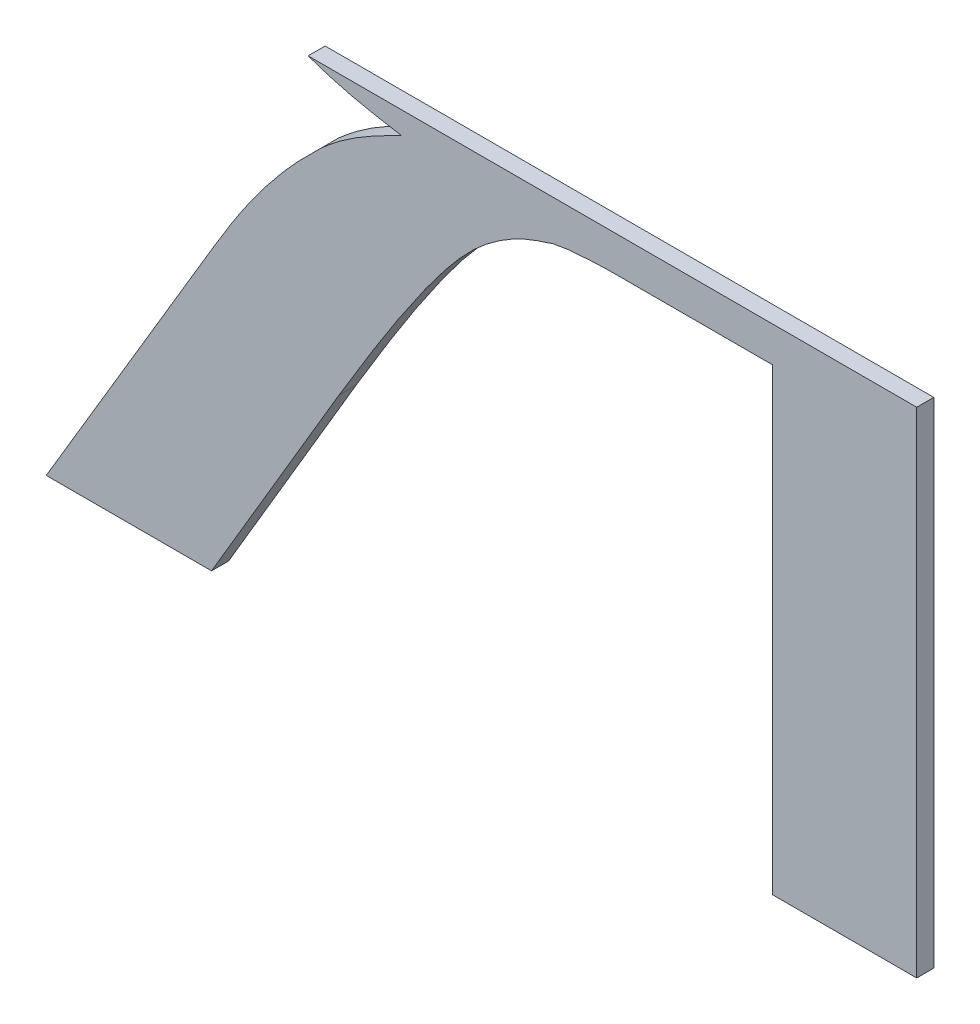
ISO-10303-21;
HEADER;
FILE_DESCRIPTION(('STEP AP214'),'2;1');
FILE_NAME('part.step','',(''),(''),'','','');
FILE_SCHEMA(('AUTOMOTIVE_DESIGN { 1 0 10303 214 1 1 1 1 }'));
ENDSEC;
DATA;
#1=APPLICATION_CONTEXT('core data for automotive mechanical design processes');
#2=APPLICATION_PROTOCOL_DEFINITION('international standard','automotive_design',2000,#1);
#3=PRODUCT_CONTEXT('',#1,'mechanical');
#4=PRODUCT('Part','Part','',(#3));
#5=PRODUCT_RELATED_PRODUCT_CATEGORY('part','',(#4));
#6=PRODUCT_DEFINITION_FORMATION('','',#4);
#7=PRODUCT_DEFINITION_CONTEXT('part definition',#1,'design');
#8=PRODUCT_DEFINITION('design','',#6,#7);
#9=PRODUCT_DEFINITION_SHAPE('','',#8);
#10=(LENGTH_UNIT() NAMED_UNIT(*) SI_UNIT(.MILLI.,.METRE.));
#11=(NAMED_UNIT(*) PLANE_ANGLE_UNIT() SI_UNIT($,.RADIAN.));
#12=(NAMED_UNIT(*) SI_UNIT($,.STERADIAN.) SOLID_ANGLE_UNIT());
#13=UNCERTAINTY_MEASURE_WITH_UNIT(LENGTH_MEASURE(1.E-05),#10,'distance_accuracy_value','');
#14=(GEOMETRIC_REPRESENTATION_CONTEXT(3) GLOBAL_UNCERTAINTY_ASSIGNED_CONTEXT((#13)) GLOBAL_UNIT_ASSIGNED_CONTEXT((#10,
#11,#12)) REPRESENTATION_CONTEXT('',''));
#15=CARTESIAN_POINT('',(0.,0.,0.));
#16=DIRECTION('',(0.,0.,1.));
#17=DIRECTION('',(1.,0.,0.));
#18=AXIS2_PLACEMENT_3D('',#15,#16,#17);
#19=CARTESIAN_POINT('',(7.30769230769232,-15.,0.5));
#20=DIRECTION('',(0.,1.,0.));
#21=DIRECTION('',(0.,0.,1.));
#22=AXIS2_PLACEMENT_3D('',#19,#20,#21);
#23=PLANE('',#22);
#24=DIRECTION('',(1.,0.,0.));
#25=VECTOR('',#24,1.);
#26=CARTESIAN_POINT('',(7.30769230769232,-15.,0.));
#27=LINE('',#26,#25);
#28=CARTESIAN_POINT('',(7.30769230769232,-15.,0.));
#29=VERTEX_POINT('',#28);
#30=CARTESIAN_POINT('',(11.5384615384616,-15.,0.));
#31=VERTEX_POINT('',#30);
#32=EDGE_CURVE('E132',#29,#31,#27,.T.);
#33=ORIENTED_EDGE('',*,*,#32,.T.);
#34=DIRECTION('',(0.,0.,-1.));
#35=VECTOR('',#34,1.);
#36=CARTESIAN_POINT('',(11.5384615384616,-15.,0.5));
#37=LINE('',#36,#35);
#38=CARTESIAN_POINT('',(11.5384615384616,-15.,0.5));
#39=VERTEX_POINT('',#38);
#40=EDGE_CURVE('E48',#39,#31,#37,.T.);
#41=ORIENTED_EDGE('',*,*,#40,.F.);
#42=DIRECTION('',(1.,0.,0.));
#43=VECTOR('',#42,1.);
#44=CARTESIAN_POINT('',(7.30769230769232,-15.,0.5));
#45=LINE('',#44,#43);
#46=CARTESIAN_POINT('',(7.30769230769232,-15.,0.5));
#47=VERTEX_POINT('',#46);
#48=EDGE_CURVE('E200',#47,#39,#45,.T.);
#49=ORIENTED_EDGE('',*,*,#48,.F.);
#50=DIRECTION('',(0.,0.,-1.));
#51=VECTOR('',#50,1.);
#52=CARTESIAN_POINT('',(7.30769230769232,-15.,0.5));
#53=LINE('',#52,#51);
#54=EDGE_CURVE('E195',#47,#29,#53,.T.);
#55=ORIENTED_EDGE('',*,*,#54,.T.);
#56=EDGE_LOOP('',(#33,#41,#49,#55));
#57=FACE_BOUND('',#56,.T.);
#58=ADVANCED_FACE('F39',(#57),#23,.F.);
#59=CARTESIAN_POINT('',(7.30769230769232,-1.53846153846154,0.5));
#60=DIRECTION('',(1.,0.,0.));
#61=DIRECTION('',(0.,0.,-1.));
#62=AXIS2_PLACEMENT_3D('',#59,#60,#61);
#63=PLANE('',#62);
#64=DIRECTION('',(0.,-1.,0.));
#65=VECTOR('',#64,1.);
#66=CARTESIAN_POINT('',(7.30769230769232,-1.53846153846154,0.));
#67=LINE('',#66,#65);
#68=CARTESIAN_POINT('',(7.30769230769232,-1.53846153846154,0.));
#69=VERTEX_POINT('',#68);
#70=EDGE_CURVE('E197',#69,#29,#67,.T.);
#71=ORIENTED_EDGE('',*,*,#70,.T.);
#72=ORIENTED_EDGE('',*,*,#54,.F.);
#73=DIRECTION('',(0.,-1.,0.));
#74=VECTOR('',#73,1.);
#75=CARTESIAN_POINT('',(7.30769230769232,-1.53846153846154,0.5));
#76=LINE('',#75,#74);
#77=CARTESIAN_POINT('',(7.30769230769232,-1.53846153846154,0.5));
#78=VERTEX_POINT('',#77);
#79=EDGE_CURVE('E193',#78,#47,#76,.T.);
#80=ORIENTED_EDGE('',*,*,#79,.F.);
#81=DIRECTION('',(0.,0.,-1.));
#82=VECTOR('',#81,1.);
#83=CARTESIAN_POINT('',(7.30769230769232,-1.53846153846154,0.5));
#84=LINE('',#83,#82);
#85=EDGE_CURVE('E188',#78,#69,#84,.T.);
#86=ORIENTED_EDGE('',*,*,#85,.T.);
#87=EDGE_LOOP('',(#71,#72,#80,#86));
#88=FACE_BOUND('',#87,.T.);
#89=ADVANCED_FACE('F330',(#88),#63,.F.);
#90=CARTESIAN_POINT('',(2.97475961538463,-1.53846153846154,0.5));
#91=DIRECTION('',(0.,1.,0.));
#92=DIRECTION('',(0.,0.,1.));
#93=AXIS2_PLACEMENT_3D('',#90,#91,#92);
#94=PLANE('',#93);
#95=DIRECTION('',(1.,0.,0.));
#96=VECTOR('',#95,1.);
#97=CARTESIAN_POINT('',(2.97475961538463,-1.53846153846154,0.));
#98=LINE('',#97,#96);
#99=CARTESIAN_POINT('',(2.97475961538463,-1.53846153846154,0.));
#100=VERTEX_POINT('',#99);
#101=EDGE_CURVE('E196',#100,#69,#98,.T.);
#102=ORIENTED_EDGE('',*,*,#101,.T.);
#103=ORIENTED_EDGE('',*,*,#85,.F.);
#104=DIRECTION('',(1.,0.,0.));
#105=VECTOR('',#104,1.);
#106=CARTESIAN_POINT('',(2.97475961538463,-1.53846153846154,0.5));
#107=LINE('',#106,#105);
#108=CARTESIAN_POINT('',(2.97475961538463,-1.53846153846154,0.5));
#109=VERTEX_POINT('',#108);
#110=EDGE_CURVE('E343',#109,#78,#107,.T.);
#111=ORIENTED_EDGE('',*,*,#110,.F.);
#112=DIRECTION('',(0.,0.,-1.));
#113=VECTOR('',#112,1.);
#114=CARTESIAN_POINT('',(2.97475961538463,-1.53846153846154,0.5));
#115=LINE('',#114,#113);
#116=EDGE_CURVE('E186',#109,#100,#115,.T.);
#117=ORIENTED_EDGE('',*,*,#116,.T.);
#118=EDGE_LOOP('',(#102,#103,#111,#117));
#119=FACE_BOUND('',#118,.T.);
#120=ADVANCED_FACE('F335',(#119),#94,.F.);
#121=CARTESIAN_POINT('',(0.889423076923093,-1.67668269230769,0.5));
#122=CARTESIAN_POINT('',(1.01136443734908,-1.65469252071142,0.5));
#123=CARTESIAN_POINT('',(1.28976021879317,-1.60448829972972,0.5));
#124=CARTESIAN_POINT('',(1.76247556098656,-1.57169984296478,0.5));
#125=CARTESIAN_POINT('',(2.33522819156776,-1.53689928277355,0.5));
#126=CARTESIAN_POINT('',(2.75031178366907,-1.5379132543762,0.5));
#127=CARTESIAN_POINT('',(2.97475961538463,-1.53846153846154,0.5));
#128=B_SPLINE_CURVE_WITH_KNOTS('',3,(#121,#122,#123,#124,#125,#126,#127),.UNSPECIFIED.,.F.,.F.,
(4,1,1,1,4),(0.,0.17749465708185,0.405225623101375,0.678388108334857,1.),.UNSPECIFIED.);
#129=DIRECTION('',(0.,0.,-1.));
#130=VECTOR('',#129,1.);
#131=SURFACE_OF_LINEAR_EXTRUSION('',#128,#130);
#132=CARTESIAN_POINT('',(0.889423076923093,-1.67668269230769,0.));
#133=CARTESIAN_POINT('',(1.01136443734908,-1.65469252071142,0.));
#134=CARTESIAN_POINT('',(1.28976021879317,-1.60448829972972,0.));
#135=CARTESIAN_POINT('',(1.76247556098656,-1.57169984296478,0.));
#136=CARTESIAN_POINT('',(2.33522819156776,-1.53689928277355,0.));
#137=CARTESIAN_POINT('',(2.75031178366907,-1.5379132543762,0.));
#138=CARTESIAN_POINT('',(2.97475961538463,-1.53846153846154,0.));
#139=B_SPLINE_CURVE_WITH_KNOTS('',3,(#132,#133,#134,#135,#136,#137,#138),.UNSPECIFIED.,.F.,.F.,
(4,1,1,1,4),(0.,0.17749465708185,0.405225623101375,0.678388108334857,1.),.UNSPECIFIED.);
#140=CARTESIAN_POINT('',(0.889423076923093,-1.67668269230769,0.));
#141=VERTEX_POINT('',#140);
#142=EDGE_CURVE('E202',#141,#100,#139,.T.);
#143=ORIENTED_EDGE('',*,*,#142,.T.);
#144=ORIENTED_EDGE('',*,*,#116,.F.);
#145=CARTESIAN_POINT('',(0.889423076923093,-1.67668269230769,0.5));
#146=VERTEX_POINT('',#145);
#147=EDGE_CURVE('E261',#146,#109,#128,.T.);
#148=ORIENTED_EDGE('',*,*,#147,.F.);
#149=DIRECTION('',(0.,0.,-1.));
#150=VECTOR('',#149,1.);
#151=CARTESIAN_POINT('',(0.889423076923093,-1.67668269230769,0.5));
#152=LINE('',#151,#150);
#153=EDGE_CURVE('E183',#146,#141,#152,.T.);
#154=ORIENTED_EDGE('',*,*,#153,.T.);
#155=EDGE_LOOP('',(#143,#144,#148,#154));
#156=FACE_BOUND('',#155,.T.);
#157=ADVANCED_FACE('F280',(#156),#131,.F.);
#158=CARTESIAN_POINT('',(-5.40865384615383,-8.66586538461539,0.5));
#159=CARTESIAN_POINT('',(-5.27425483341309,-8.44362465807356,0.5));
#160=CARTESIAN_POINT('',(-5.0138116148445,-8.01295862164048,0.5));
#161=CARTESIAN_POINT('',(-4.63761071618698,-7.38399160756765,0.5));
#162=CARTESIAN_POINT('',(-4.26875810381978,-6.80492725566571,0.5));
#163=CARTESIAN_POINT('',(-3.92665361497196,-6.25921559162821,0.5));
#164=CARTESIAN_POINT('',(-3.59741407623815,-5.75676374158386,0.5));
#165=CARTESIAN_POINT('',(-3.28422071212509,-5.29582628569616,0.5));
#166=CARTESIAN_POINT('',(-2.99569274309002,-4.87035632670218,0.5));
#167=CARTESIAN_POINT('',(-2.63831355130447,-4.37499857015927,0.5));
#168=CARTESIAN_POINT('',(-2.22238352886459,-3.82688061585735,0.5));
#169=CARTESIAN_POINT('',(-1.73702173067931,-3.26242262664401,0.5));
#170=CARTESIAN_POINT('',(-1.27481339435602,-2.81238779082192,0.5));
#171=CARTESIAN_POINT('',(-0.705595298101057,-2.37108076220757,0.5));
#172=CARTESIAN_POINT('',(-0.000532570007576415,-1.95831221626847,0.5));
#173=CARTESIAN_POINT('',(0.598784058068045,-1.76865640898321,0.5));
#174=CARTESIAN_POINT('',(0.889423076923093,-1.67668269230769,0.5));
#175=B_SPLINE_CURVE_WITH_KNOTS('',3,(#158,#159,#160,#161,#162,#163,#164,#165,#166,#167,#168,
#169,#170,#171,#172,#173,#174),.UNSPECIFIED.,.F.,.F.,(4,1,1,1,1,1,1,1,1,1,1,1,1,1,4),(0.,
0.0807814705861227,0.15654122579559,0.227934986843486,0.294310317304601,0.356867863554811,
0.414758559259275,0.467641396834016,0.516748421530013,0.604729741894054,0.68157065293939,
0.748109541621983,0.804941099535281,0.905406049500003,1.),.UNSPECIFIED.);
#176=DIRECTION('',(0.,0.,-1.));
#177=VECTOR('',#176,1.);
#178=SURFACE_OF_LINEAR_EXTRUSION('',#175,#177);
#179=CARTESIAN_POINT('',(-5.40865384615383,-8.66586538461539,0.));
#180=CARTESIAN_POINT('',(-5.27425483341309,-8.44362465807356,0.));
#181=CARTESIAN_POINT('',(-5.0138116148445,-8.01295862164048,0.));
#182=CARTESIAN_POINT('',(-4.63761071618698,-7.38399160756765,0.));
#183=CARTESIAN_POINT('',(-4.26875810381978,-6.80492725566571,0.));
#184=CARTESIAN_POINT('',(-3.92665361497196,-6.25921559162821,0.));
#185=CARTESIAN_POINT('',(-3.59741407623815,-5.75676374158386,0.));
#186=CARTESIAN_POINT('',(-3.28422071212509,-5.29582628569616,0.));
#187=CARTESIAN_POINT('',(-2.99569274309002,-4.87035632670218,0.));
#188=CARTESIAN_POINT('',(-2.63831355130447,-4.37499857015927,0.));
#189=CARTESIAN_POINT('',(-2.22238352886459,-3.82688061585735,0.));
#190=CARTESIAN_POINT('',(-1.73702173067931,-3.26242262664401,0.));
#191=CARTESIAN_POINT('',(-1.27481339435602,-2.81238779082192,0.));
#192=CARTESIAN_POINT('',(-0.705595298101057,-2.37108076220757,0.));
#193=CARTESIAN_POINT('',(-0.000532570007576415,-1.95831221626847,0.));
#194=CARTESIAN_POINT('',(0.598784058068045,-1.76865640898321,0.));
#195=CARTESIAN_POINT('',(0.889423076923093,-1.67668269230769,0.));
#196=B_SPLINE_CURVE_WITH_KNOTS('',3,(#179,#180,#181,#182,#183,#184,#185,#186,#187,#188,#189,
#190,#191,#192,#193,#194,#195),.UNSPECIFIED.,.F.,.F.,(4,1,1,1,1,1,1,1,1,1,1,1,1,1,4),(0.,
0.0807814705861227,0.15654122579559,0.227934986843486,0.294310317304601,0.356867863554811,
0.414758559259275,0.467641396834016,0.516748421530013,0.604729741894054,0.68157065293939,
0.748109541621983,0.804941099535281,0.905406049500003,1.),.UNSPECIFIED.);
#197=CARTESIAN_POINT('',(-5.40865384615383,-8.66586538461539,0.));
#198=VERTEX_POINT('',#197);
#199=EDGE_CURVE('E203',#198,#141,#196,.T.);
#200=ORIENTED_EDGE('',*,*,#199,.T.);
#201=ORIENTED_EDGE('',*,*,#153,.F.);
#202=CARTESIAN_POINT('',(-5.40865384615383,-8.66586538461539,0.5));
#203=VERTEX_POINT('',#202);
#204=EDGE_CURVE('E251',#203,#146,#175,.T.);
#205=ORIENTED_EDGE('',*,*,#204,.F.);
#206=DIRECTION('',(0.,0.,-1.));
#207=VECTOR('',#206,1.);
#208=CARTESIAN_POINT('',(-5.40865384615383,-8.66586538461539,0.5));
#209=LINE('',#208,#207);
#210=EDGE_CURVE('E179',#203,#198,#209,.T.);
#211=ORIENTED_EDGE('',*,*,#210,.T.);
#212=EDGE_LOOP('',(#200,#201,#205,#211));
#213=FACE_BOUND('',#212,.T.);
#214=ADVANCED_FACE('F275',(#213),#178,.F.);
#215=CARTESIAN_POINT('',(-9.1466346153846,-15.,0.5));
#216=DIRECTION('',(-0.861219188778507,0.508233714819954,0.));
#217=DIRECTION('',(-0.508233714819954,-0.861219188778507,0.));
#218=AXIS2_PLACEMENT_3D('',#215,#216,#217);
#219=PLANE('',#218);
#220=DIRECTION('',(0.508233714819954,0.861219188778507,0.));
#221=VECTOR('',#220,1.);
#222=CARTESIAN_POINT('',(-9.1466346153846,-15.,0.));
#223=LINE('',#222,#221);
#224=CARTESIAN_POINT('',(-9.1466346153846,-15.,0.));
#225=VERTEX_POINT('',#224);
#226=EDGE_CURVE('E212',#225,#198,#223,.T.);
#227=ORIENTED_EDGE('',*,*,#226,.T.);
#228=ORIENTED_EDGE('',*,*,#210,.F.);
#229=DIRECTION('',(0.508233714819954,0.861219188778507,0.));
#230=VECTOR('',#229,1.);
#231=CARTESIAN_POINT('',(-9.1466346153846,-15.,0.5));
#232=LINE('',#231,#230);
#233=CARTESIAN_POINT('',(-9.1466346153846,-15.,0.5));
#234=VERTEX_POINT('',#233);
#235=EDGE_CURVE('E252',#234,#203,#232,.T.);
#236=ORIENTED_EDGE('',*,*,#235,.F.);
#237=DIRECTION('',(0.,0.,-1.));
#238=VECTOR('',#237,1.);
#239=CARTESIAN_POINT('',(-9.1466346153846,-15.,0.5));
#240=LINE('',#239,#238);
#241=EDGE_CURVE('E180',#234,#225,#240,.T.);
#242=ORIENTED_EDGE('',*,*,#241,.T.);
#243=EDGE_LOOP('',(#227,#228,#236,#242));
#244=FACE_BOUND('',#243,.T.);
#245=ADVANCED_FACE('F276',(#244),#219,.F.);
#246=CARTESIAN_POINT('',(-13.9963942307692,-15.,0.5));
#247=DIRECTION('',(0.,1.,0.));
#248=DIRECTION('',(0.,0.,1.));
#249=AXIS2_PLACEMENT_3D('',#246,#247,#248);
#250=PLANE('',#249);
#251=DIRECTION('',(1.,0.,0.));
#252=VECTOR('',#251,1.);
#253=CARTESIAN_POINT('',(-13.9963942307692,-15.,0.));
#254=LINE('',#253,#252);
#255=CARTESIAN_POINT('',(-13.9963942307692,-15.,0.));
#256=VERTEX_POINT('',#255);
#257=EDGE_CURVE('E220',#256,#225,#254,.T.);
#258=ORIENTED_EDGE('',*,*,#257,.T.);
#259=ORIENTED_EDGE('',*,*,#241,.F.);
#260=DIRECTION('',(1.,0.,0.));
#261=VECTOR('',#260,1.);
#262=CARTESIAN_POINT('',(-13.9963942307692,-15.,0.5));
#263=LINE('',#262,#261);
#264=CARTESIAN_POINT('',(-13.9963942307692,-15.,0.5));
#265=VERTEX_POINT('',#264);
#266=EDGE_CURVE('E246',#265,#234,#263,.T.);
#267=ORIENTED_EDGE('',*,*,#266,.F.);
#268=DIRECTION('',(0.,0.,-1.));
#269=VECTOR('',#268,1.);
#270=CARTESIAN_POINT('',(-13.9963942307692,-15.,0.5));
#271=LINE('',#270,#269);
#272=EDGE_CURVE('E174',#265,#256,#271,.T.);
#273=ORIENTED_EDGE('',*,*,#272,.T.);
#274=EDGE_LOOP('',(#258,#259,#267,#273));
#275=FACE_BOUND('',#274,.T.);
#276=ADVANCED_FACE('F247',(#275),#250,.F.);
#277=CARTESIAN_POINT('',(-9.07451923076921,-6.71875,0.5));
#278=DIRECTION('',(0.859632156750452,-0.510913451653571,0.));
#279=DIRECTION('',(0.510913451653571,0.859632156750452,0.));
#280=AXIS2_PLACEMENT_3D('',#277,#278,#279);
#281=PLANE('',#280);
#282=DIRECTION('',(-0.510913451653571,-0.859632156750452,0.));
#283=VECTOR('',#282,1.);
#284=CARTESIAN_POINT('',(-9.07451923076921,-6.71875,0.));
#285=LINE('',#284,#283);
#286=CARTESIAN_POINT('',(-9.07451923076921,-6.71875,0.));
#287=VERTEX_POINT('',#286);
#288=EDGE_CURVE('E219',#287,#256,#285,.T.);
#289=ORIENTED_EDGE('',*,*,#288,.T.);
#290=ORIENTED_EDGE('',*,*,#272,.F.);
#291=DIRECTION('',(-0.510913451653571,-0.859632156750452,0.));
#292=VECTOR('',#291,1.);
#293=CARTESIAN_POINT('',(-9.07451923076921,-6.71875,0.5));
#294=LINE('',#293,#292);
#295=CARTESIAN_POINT('',(-9.07451923076921,-6.71875,0.5));
#296=VERTEX_POINT('',#295);
#297=EDGE_CURVE('E254',#296,#265,#294,.T.);
#298=ORIENTED_EDGE('',*,*,#297,.F.);
#299=DIRECTION('',(0.,0.,-1.));
#300=VECTOR('',#299,1.);
#301=CARTESIAN_POINT('',(-9.07451923076921,-6.71875,0.5));
#302=LINE('',#301,#300);
#303=EDGE_CURVE('E173',#296,#287,#302,.T.);
#304=ORIENTED_EDGE('',*,*,#303,.T.);
#305=EDGE_LOOP('',(#289,#290,#298,#304));
#306=FACE_BOUND('',#305,.T.);
#307=ADVANCED_FACE('F244',(#306),#281,.F.);
#308=CARTESIAN_POINT('',(-5.91346153846152,-2.63221153846154,0.5));
#309=CARTESIAN_POINT('',(-6.19686401280369,-2.91002878312352,0.5));
#310=CARTESIAN_POINT('',(-6.77899282863054,-3.4806851404004,0.5));
#311=CARTESIAN_POINT('',(-7.58119162230754,-4.45268008275198,0.5));
#312=CARTESIAN_POINT('',(-8.35895090334019,-5.53465960412931,0.5));
#313=CARTESIAN_POINT('',(-8.83149830899095,-6.3166098710382,0.5));
#314=CARTESIAN_POINT('',(-9.07451923076921,-6.71875,0.5));
#315=B_SPLINE_CURVE_WITH_KNOTS('',3,(#308,#309,#310,#311,#312,#313,#314),.UNSPECIFIED.,.F.,.F.,
(4,1,1,1,4),(0.,0.229527569700857,0.471465934303229,0.728186348499869,1.),.UNSPECIFIED.);
#316=DIRECTION('',(0.,0.,-1.));
#317=VECTOR('',#316,1.);
#318=SURFACE_OF_LINEAR_EXTRUSION('',#315,#317);
#319=CARTESIAN_POINT('',(-5.91346153846152,-2.63221153846154,0.));
#320=CARTESIAN_POINT('',(-6.19686401280369,-2.91002878312352,0.));
#321=CARTESIAN_POINT('',(-6.77899282863054,-3.4806851404004,0.));
#322=CARTESIAN_POINT('',(-7.58119162230754,-4.45268008275198,0.));
#323=CARTESIAN_POINT('',(-8.35895090334019,-5.53465960412931,0.));
#324=CARTESIAN_POINT('',(-8.83149830899095,-6.3166098710382,0.));
#325=CARTESIAN_POINT('',(-9.07451923076921,-6.71875,0.));
#326=B_SPLINE_CURVE_WITH_KNOTS('',3,(#319,#320,#321,#322,#323,#324,#325),.UNSPECIFIED.,.F.,.F.,
(4,1,1,1,4),(0.,0.229527569700857,0.471465934303229,0.728186348499869,1.),.UNSPECIFIED.);
#327=CARTESIAN_POINT('',(-5.91346153846152,-2.63221153846154,0.));
#328=VERTEX_POINT('',#327);
#329=EDGE_CURVE('E217',#328,#287,#326,.T.);
#330=ORIENTED_EDGE('',*,*,#329,.T.);
#331=ORIENTED_EDGE('',*,*,#303,.F.);
#332=CARTESIAN_POINT('',(-5.91346153846152,-2.63221153846154,0.5));
#333=VERTEX_POINT('',#332);
#334=EDGE_CURVE('E237',#333,#296,#315,.T.);
#335=ORIENTED_EDGE('',*,*,#334,.F.);
#336=DIRECTION('',(0.,0.,-1.));
#337=VECTOR('',#336,1.);
#338=CARTESIAN_POINT('',(-5.91346153846152,-2.63221153846154,0.5));
#339=LINE('',#338,#337);
#340=EDGE_CURVE('E166',#333,#328,#339,.T.);
#341=ORIENTED_EDGE('',*,*,#340,.T.);
#342=EDGE_LOOP('',(#330,#331,#335,#341));
#343=FACE_BOUND('',#342,.T.);
#344=ADVANCED_FACE('F234',(#343),#318,.F.);
#345=CARTESIAN_POINT('',(-3.58173076923075,-1.15384615384615,0.5));
#346=CARTESIAN_POINT('',(-3.82325814136208,-1.27586045474257,0.5));
#347=CARTESIAN_POINT('',(-4.28192731628053,-1.50757000478884,0.5));
#348=CARTESIAN_POINT('',(-4.91696047250625,-1.87088856684179,0.5));
#349=CARTESIAN_POINT('',(-5.45525609672202,-2.2421106079673,0.5));
#350=CARTESIAN_POINT('',(-5.76711802884799,-2.50761952345774,0.5));
#351=CARTESIAN_POINT('',(-5.91346153846152,-2.63221153846154,0.5));
#352=B_SPLINE_CURVE_WITH_KNOTS('',3,(#345,#346,#347,#348,#349,#350,#351),.UNSPECIFIED.,.F.,.F.,
(4,1,1,1,4),(0.,0.293076243319221,0.55656233711819,0.791913609209812,1.),.UNSPECIFIED.);
#353=DIRECTION('',(0.,0.,-1.));
#354=VECTOR('',#353,1.);
#355=SURFACE_OF_LINEAR_EXTRUSION('',#352,#354);
#356=CARTESIAN_POINT('',(-3.58173076923075,-1.15384615384615,0.));
#357=CARTESIAN_POINT('',(-3.82325814136208,-1.27586045474257,0.));
#358=CARTESIAN_POINT('',(-4.28192731628053,-1.50757000478884,0.));
#359=CARTESIAN_POINT('',(-4.91696047250625,-1.87088856684179,0.));
#360=CARTESIAN_POINT('',(-5.45525609672202,-2.2421106079673,0.));
#361=CARTESIAN_POINT('',(-5.76711802884799,-2.50761952345774,0.));
#362=CARTESIAN_POINT('',(-5.91346153846152,-2.63221153846154,0.));
#363=B_SPLINE_CURVE_WITH_KNOTS('',3,(#356,#357,#358,#359,#360,#361,#362),.UNSPECIFIED.,.F.,.F.,
(4,1,1,1,4),(0.,0.293076243319221,0.55656233711819,0.791913609209812,1.),.UNSPECIFIED.);
#364=CARTESIAN_POINT('',(-3.58173076923075,-1.15384615384615,0.));
#365=VERTEX_POINT('',#364);
#366=EDGE_CURVE('E149',#365,#328,#363,.T.);
#367=ORIENTED_EDGE('',*,*,#366,.T.);
#368=ORIENTED_EDGE('',*,*,#340,.F.);
#369=CARTESIAN_POINT('',(-3.58173076923075,-1.15384615384615,0.5));
#370=VERTEX_POINT('',#369);
#371=EDGE_CURVE('E294',#370,#333,#352,.T.);
#372=ORIENTED_EDGE('',*,*,#371,.F.);
#373=DIRECTION('',(0.,0.,-1.));
#374=VECTOR('',#373,1.);
#375=CARTESIAN_POINT('',(-3.58173076923075,-1.15384615384615,0.5));
#376=LINE('',#375,#374);
#377=EDGE_CURVE('E163',#370,#365,#376,.T.);
#378=ORIENTED_EDGE('',*,*,#377,.T.);
#379=EDGE_LOOP('',(#367,#368,#372,#378));
#380=FACE_BOUND('',#379,.T.);
#381=ADVANCED_FACE('F231',(#380),#355,.F.);
#382=CARTESIAN_POINT('',(-8.58731063474944,13.4318140781607,0.5));
#383=DIRECTION('',(0.,0.,-1.));
#384=DIRECTION('',(-1.,0.,0.));
#385=AXIS2_PLACEMENT_3D('',#382,#383,#384);
#386=PLANE('',#385);
#387=DIRECTION('',(0.,1.,0.));
#388=VECTOR('',#387,1.);
#389=CARTESIAN_POINT('',(11.5384615384616,-15.,0.5));
#390=LINE('',#389,#388);
#391=CARTESIAN_POINT('',(11.5384615384616,-0.5,0.5));
#392=VERTEX_POINT('',#391);
#393=EDGE_CURVE('E307',#39,#392,#390,.T.);
#394=ORIENTED_EDGE('',*,*,#393,.T.);
#395=DIRECTION('',(-1.,0.,0.));
#396=VECTOR('',#395,1.);
#397=CARTESIAN_POINT('',(-8.58731063474944,-0.5,0.5));
#398=LINE('',#397,#396);
#399=CARTESIAN_POINT('',(-6.31439538030958,-0.500000001109924,0.5));
#400=VERTEX_POINT('',#399);
#401=EDGE_CURVE('E127',#392,#400,#398,.T.);
#402=ORIENTED_EDGE('',*,*,#401,.T.);
#403=CARTESIAN_POINT('',(-11.5384615384615,6.91105769230769,0.5));
#404=CARTESIAN_POINT('',(-11.5325910596808,6.65443287104843,0.5));
#405=CARTESIAN_POINT('',(-11.5209964615086,6.14758125048622,0.5));
#406=CARTESIAN_POINT('',(-11.4321806731945,5.40237369942187,0.5));
#407=CARTESIAN_POINT('',(-11.27147567516,4.69035785069766,0.5));
#408=CARTESIAN_POINT('',(-11.065403190656,4.00529799715841,0.5));
#409=CARTESIAN_POINT('',(-10.7833528257358,3.35690034192733,0.5));
#410=CARTESIAN_POINT('',(-10.4566097203037,2.73192116530323,0.5));
#411=CARTESIAN_POINT('',(-10.0518214672469,2.14753031268846,0.5));
#412=CARTESIAN_POINT('',(-9.59861625564332,1.58816639265529,0.5));
#413=CARTESIAN_POINT('',(-9.07891141140609,1.06580948697466,0.5));
#414=CARTESIAN_POINT('',(-8.48813510211721,0.599304948528562,0.5));
#415=CARTESIAN_POINT('',(-7.83214355776586,0.179683182375531,0.5));
#416=CARTESIAN_POINT('',(-7.10784732151527,-0.181478283915422,0.5));
#417=CARTESIAN_POINT('',(-6.32358377122331,-0.511597010464015,0.5));
#418=CARTESIAN_POINT('',(-5.46951255367587,-0.777424515079016,0.5));
#419=CARTESIAN_POINT('',(-4.54908062908904,-0.994493056469318,0.5));
#420=CARTESIAN_POINT('',(-3.91099443386552,-1.0996060210974,0.5));
#421=CARTESIAN_POINT('',(-3.58173076923075,-1.15384615384615,0.5));
#422=B_SPLINE_CURVE_WITH_KNOTS('',3,(#403,#404,#405,#406,#407,#408,#409,#410,#411,#412,#413,
#414,#415,#416,#417,#418,#419,#420,#421),.UNSPECIFIED.,.F.,.F.,(4,1,1,1,1,1,1,1,1,1,1,1,1,1,1,1,
4),(0.,0.0614130692946595,0.121295023384547,0.17922404230872,0.235938094734832,
0.292216833267361,0.348196639434207,0.404444738963359,0.462025533922997,0.520334211868149,
0.580382901650838,0.641825904813988,0.706363209796628,0.77385139382756,0.845266257356883,
0.920154675768406,1.),.UNSPECIFIED.);
#423=EDGE_CURVE('E302',#400,#370,#422,.T.);
#424=ORIENTED_EDGE('',*,*,#423,.T.);
#425=ORIENTED_EDGE('',*,*,#371,.T.);
#426=ORIENTED_EDGE('',*,*,#334,.T.);
#427=ORIENTED_EDGE('',*,*,#297,.T.);
#428=ORIENTED_EDGE('',*,*,#266,.T.);
#429=ORIENTED_EDGE('',*,*,#235,.T.);
#430=ORIENTED_EDGE('',*,*,#204,.T.);
#431=ORIENTED_EDGE('',*,*,#147,.T.);
#432=ORIENTED_EDGE('',*,*,#110,.T.);
#433=ORIENTED_EDGE('',*,*,#79,.T.);
#434=ORIENTED_EDGE('',*,*,#48,.T.);
#435=EDGE_LOOP('',(#394,#402,#424,#425,#426,#427,#428,#429,#430,#431,#432,#433,#434));
#436=FACE_BOUND('',#435,.T.);
#437=ADVANCED_FACE('F320',(#436),#386,.F.);
#438=DIRECTION('',(0.,0.,-1.));
#439=VECTOR('',#438,1.);
#440=SURFACE_OF_LINEAR_EXTRUSION('',#422,#439);
#441=ORIENTED_EDGE('',*,*,#423,.F.);
#442=DIRECTION('',(0.,0.,-1.));
#443=VECTOR('',#442,1.);
#444=CARTESIAN_POINT('',(-6.31439538335862,-0.5,0.5));
#445=LINE('',#444,#443);
#446=CARTESIAN_POINT('',(-6.3138420827505,-0.5,-2.5E-05));
#447=VERTEX_POINT('',#446);
#448=EDGE_CURVE('E53',#400,#447,#445,.T.);
#449=ORIENTED_EDGE('',*,*,#448,.T.);
#450=CARTESIAN_POINT('',(-11.5384615384615,6.91105769230769,0.));
#451=CARTESIAN_POINT('',(-11.5325910596808,6.65443287104843,0.));
#452=CARTESIAN_POINT('',(-11.5209964615086,6.14758125048622,0.));
#453=CARTESIAN_POINT('',(-11.4321806731945,5.40237369942187,0.));
#454=CARTESIAN_POINT('',(-11.27147567516,4.69035785069766,0.));
#455=CARTESIAN_POINT('',(-11.065403190656,4.00529799715841,0.));
#456=CARTESIAN_POINT('',(-10.7833528257358,3.35690034192733,0.));
#457=CARTESIAN_POINT('',(-10.4566097203037,2.73192116530323,0.));
#458=CARTESIAN_POINT('',(-10.0518214672469,2.14753031268846,0.));
#459=CARTESIAN_POINT('',(-9.59861625564332,1.58816639265529,0.));
#460=CARTESIAN_POINT('',(-9.07891141140609,1.06580948697466,0.));
#461=CARTESIAN_POINT('',(-8.48813510211721,0.599304948528562,0.));
#462=CARTESIAN_POINT('',(-7.83214355776586,0.179683182375531,0.));
#463=CARTESIAN_POINT('',(-7.10784732151527,-0.181478283915422,0.));
#464=CARTESIAN_POINT('',(-6.32358377122331,-0.511597010464015,0.));
#465=CARTESIAN_POINT('',(-5.46951255367587,-0.777424515079016,0.));
#466=CARTESIAN_POINT('',(-4.54908062908904,-0.994493056469318,0.));
#467=CARTESIAN_POINT('',(-3.91099443386552,-1.0996060210974,0.));
#468=CARTESIAN_POINT('',(-3.58173076923075,-1.15384615384615,0.));
#469=B_SPLINE_CURVE_WITH_KNOTS('',3,(#450,#451,#452,#453,#454,#455,#456,#457,#458,#459,#460,
#461,#462,#463,#464,#465,#466,#467,#468),.UNSPECIFIED.,.F.,.F.,(4,1,1,1,1,1,1,1,1,1,1,1,1,1,1,1,
4),(0.,0.0614130692946595,0.121295023384547,0.17922404230872,0.235938094734832,
0.292216833267361,0.348196639434207,0.404444738963359,0.462025533922997,0.520334211868149,
0.580382901650838,0.641825904813988,0.706363209796628,0.77385139382756,0.845266257356883,
0.920154675768406,1.),.UNSPECIFIED.);
#470=EDGE_CURVE('E142',#447,#365,#469,.T.);
#471=ORIENTED_EDGE('',*,*,#470,.T.);
#472=ORIENTED_EDGE('',*,*,#377,.F.);
#473=EDGE_LOOP('',(#441,#449,#471,#472));
#474=FACE_BOUND('',#473,.T.);
#475=ADVANCED_FACE('F314',(#474),#440,.F.);
#476=CARTESIAN_POINT('',(11.5384615384616,-15.,0.5));
#477=DIRECTION('',(-1.,0.,0.));
#478=DIRECTION('',(0.,0.,1.));
#479=AXIS2_PLACEMENT_3D('',#476,#477,#478);
#480=PLANE('',#479);
#481=DIRECTION('',(0.,1.,0.));
#482=VECTOR('',#481,1.);
#483=CARTESIAN_POINT('',(11.5384615384616,-15.,0.));
#484=LINE('',#483,#482);
#485=CARTESIAN_POINT('',(11.5384615384616,-0.5,0.));
#486=VERTEX_POINT('',#485);
#487=EDGE_CURVE('E139',#31,#486,#484,.T.);
#488=ORIENTED_EDGE('',*,*,#487,.T.);
#489=DIRECTION('',(0.,0.,1.));
#490=VECTOR('',#489,1.);
#491=CARTESIAN_POINT('',(11.5384615384616,-0.5,0.5));
#492=LINE('',#491,#490);
#493=EDGE_CURVE('E126',#486,#392,#492,.T.);
#494=ORIENTED_EDGE('',*,*,#493,.T.);
#495=ORIENTED_EDGE('',*,*,#393,.F.);
#496=ORIENTED_EDGE('',*,*,#40,.T.);
#497=EDGE_LOOP('',(#488,#494,#495,#496));
#498=FACE_BOUND('',#497,.T.);
#499=ADVANCED_FACE('F143',(#498),#480,.F.);
#500=CARTESIAN_POINT('',(-8.58731063474944,13.4318140781607,0.));
#501=DIRECTION('',(0.,0.,-1.));
#502=DIRECTION('',(-1.,0.,0.));
#503=AXIS2_PLACEMENT_3D('',#500,#501,#502);
#504=PLANE('',#503);
#505=DIRECTION('',(-1.,0.,0.));
#506=VECTOR('',#505,1.);
#507=CARTESIAN_POINT('',(-8.58731063474944,-0.5,0.));
#508=LINE('',#507,#506);
#509=EDGE_CURVE('E11',#486,#447,#508,.T.);
#510=ORIENTED_EDGE('',*,*,#509,.F.);
#511=ORIENTED_EDGE('',*,*,#487,.F.);
#512=ORIENTED_EDGE('',*,*,#32,.F.);
#513=ORIENTED_EDGE('',*,*,#70,.F.);
#514=ORIENTED_EDGE('',*,*,#101,.F.);
#515=ORIENTED_EDGE('',*,*,#142,.F.);
#516=ORIENTED_EDGE('',*,*,#199,.F.);
#517=ORIENTED_EDGE('',*,*,#226,.F.);
#518=ORIENTED_EDGE('',*,*,#257,.F.);
#519=ORIENTED_EDGE('',*,*,#288,.F.);
#520=ORIENTED_EDGE('',*,*,#329,.F.);
#521=ORIENTED_EDGE('',*,*,#366,.F.);
#522=ORIENTED_EDGE('',*,*,#470,.F.);
#523=EDGE_LOOP('',(#510,#511,#512,#513,#514,#515,#516,#517,#518,#519,#520,#521,#522));
#524=FACE_BOUND('',#523,.T.);
#525=ADVANCED_FACE('F138',(#524),#504,.T.);
#526=CARTESIAN_POINT('',(-17.,-0.5,1.000025));
#527=DIRECTION('',(0.,-1.,0.));
#528=DIRECTION('',(0.,0.,-1.));
#529=AXIS2_PLACEMENT_3D('',#526,#527,#528);
#530=PLANE('',#529);
#531=ORIENTED_EDGE('',*,*,#509,.T.);
#532=ORIENTED_EDGE('',*,*,#448,.F.);
#533=ORIENTED_EDGE('',*,*,#401,.F.);
#534=ORIENTED_EDGE('',*,*,#493,.F.);
#535=EDGE_LOOP('',(#531,#532,#533,#534));
#536=FACE_BOUND('',#535,.T.);
#537=ADVANCED_FACE('F129',(#536),#530,.F.);
#538=CLOSED_SHELL('',(#58,#89,#120,#157,#214,#245,#276,#307,#344,#381,#437,#475,#499,#525,#537));
#539=MANIFOLD_SOLID_BREP('B2',#538);
#540=ADVANCED_BREP_SHAPE_REPRESENTATION('',(#18,#539),#14);
#541=SHAPE_DEFINITION_REPRESENTATION(#9,#540);
ENDSEC;
END-ISO-10303-21;
